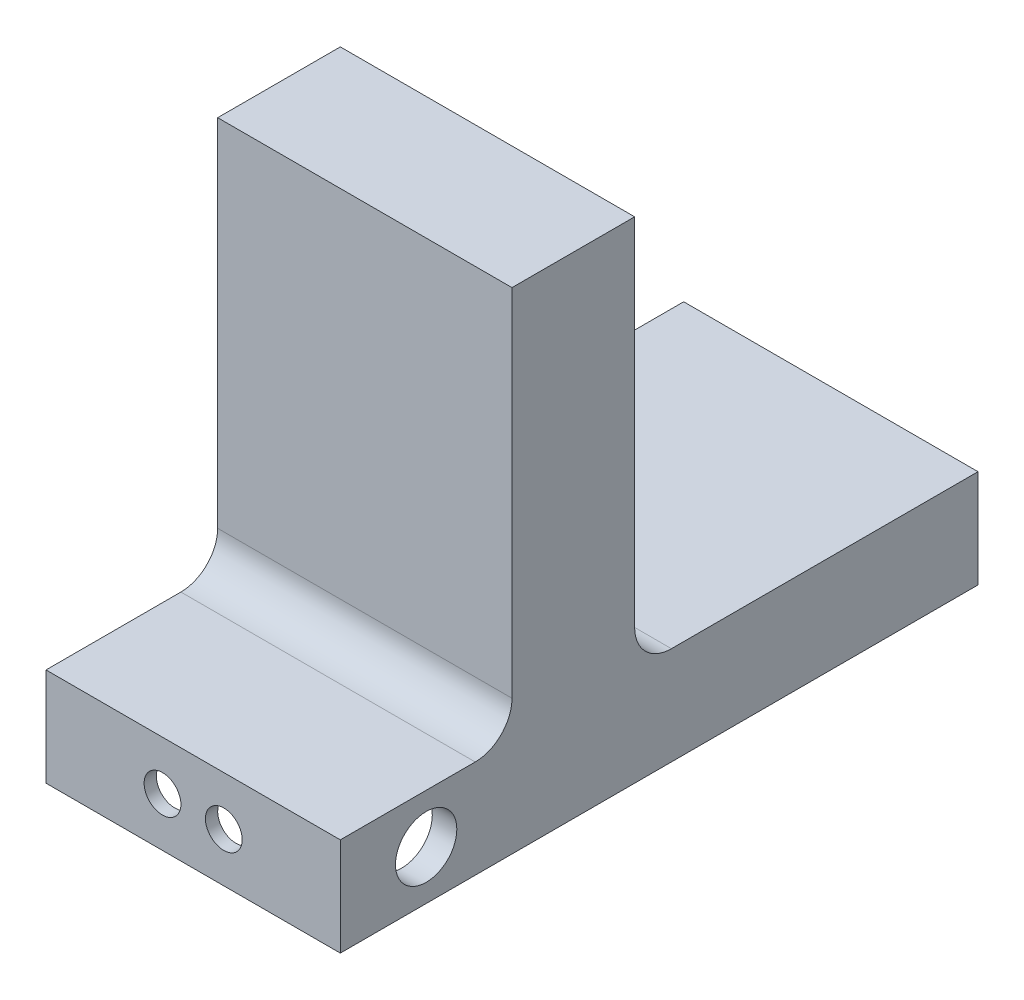
ISO-10303-21;
HEADER;
FILE_DESCRIPTION(('STEP AP214'),'2;1');
FILE_NAME('part.step','',(''),(''),'','','');
FILE_SCHEMA(('AUTOMOTIVE_DESIGN { 1 0 10303 214 1 1 1 1 }'));
ENDSEC;
DATA;
#1=APPLICATION_CONTEXT('core data for automotive mechanical design processes');
#2=APPLICATION_PROTOCOL_DEFINITION('international standard','automotive_design',2000,#1);
#3=PRODUCT_CONTEXT('',#1,'mechanical');
#4=PRODUCT('Part','Part','',(#3));
#5=PRODUCT_RELATED_PRODUCT_CATEGORY('part','',(#4));
#6=PRODUCT_DEFINITION_FORMATION('','',#4);
#7=PRODUCT_DEFINITION_CONTEXT('part definition',#1,'design');
#8=PRODUCT_DEFINITION('design','',#6,#7);
#9=PRODUCT_DEFINITION_SHAPE('','',#8);
#10=(LENGTH_UNIT() NAMED_UNIT(*) SI_UNIT(.MILLI.,.METRE.));
#11=(NAMED_UNIT(*) PLANE_ANGLE_UNIT() SI_UNIT($,.RADIAN.));
#12=(NAMED_UNIT(*) SI_UNIT($,.STERADIAN.) SOLID_ANGLE_UNIT());
#13=UNCERTAINTY_MEASURE_WITH_UNIT(LENGTH_MEASURE(1.E-05),#10,'distance_accuracy_value','');
#14=(GEOMETRIC_REPRESENTATION_CONTEXT(3) GLOBAL_UNCERTAINTY_ASSIGNED_CONTEXT((#13)) GLOBAL_UNIT_ASSIGNED_CONTEXT((#10,
#11,#12)) REPRESENTATION_CONTEXT('',''));
#15=CARTESIAN_POINT('',(0.,0.,0.));
#16=DIRECTION('',(0.,0.,1.));
#17=DIRECTION('',(1.,0.,0.));
#18=AXIS2_PLACEMENT_3D('',#15,#16,#17);
#19=CARTESIAN_POINT('',(9.99999999999999,35.,85.));
#20=DIRECTION('',(0.,0.,1.));
#21=DIRECTION('',(1.,0.,0.));
#22=AXIS2_PLACEMENT_3D('',#19,#20,#21);
#23=PLANE('',#22);
#24=DIRECTION('',(-1.,0.,0.));
#25=VECTOR('',#24,1.);
#26=CARTESIAN_POINT('',(9.99999999999999,0.,85.));
#27=LINE('',#26,#25);
#28=CARTESIAN_POINT('',(110.,0.,85.));
#29=VERTEX_POINT('',#28);
#30=CARTESIAN_POINT('',(67.5,0.,85.));
#31=VERTEX_POINT('',#30);
#32=EDGE_CURVE('E275',#29,#31,#27,.T.);
#33=ORIENTED_EDGE('',*,*,#32,.T.);
#34=DIRECTION('',(0.,-1.,0.));
#35=VECTOR('',#34,1.);
#36=CARTESIAN_POINT('',(67.5,0.,85.));
#37=LINE('',#36,#35);
#38=CARTESIAN_POINT('',(67.5,5.,85.));
#39=VERTEX_POINT('',#38);
#40=EDGE_CURVE('E193',#39,#31,#37,.T.);
#41=ORIENTED_EDGE('',*,*,#40,.F.);
#42=DIRECTION('',(-1.,0.,0.));
#43=VECTOR('',#42,1.);
#44=CARTESIAN_POINT('',(85.,5.,85.));
#45=LINE('',#44,#43);
#46=CARTESIAN_POINT('',(85.,5.,85.));
#47=VERTEX_POINT('',#46);
#48=EDGE_CURVE('E249',#47,#39,#45,.T.);
#49=ORIENTED_EDGE('',*,*,#48,.F.);
#50=DIRECTION('',(0.,-1.,0.));
#51=VECTOR('',#50,1.);
#52=CARTESIAN_POINT('',(85.,35.,85.));
#53=LINE('',#52,#51);
#54=CARTESIAN_POINT('',(85.,35.,85.));
#55=VERTEX_POINT('',#54);
#56=EDGE_CURVE('E232',#55,#47,#53,.T.);
#57=ORIENTED_EDGE('',*,*,#56,.F.);
#58=DIRECTION('',(-1.,0.,0.));
#59=VECTOR('',#58,1.);
#60=CARTESIAN_POINT('',(9.99999999999999,35.,85.));
#61=LINE('',#60,#59);
#62=CARTESIAN_POINT('',(110.,35.,85.));
#63=VERTEX_POINT('',#62);
#64=EDGE_CURVE('E282',#63,#55,#61,.T.);
#65=ORIENTED_EDGE('',*,*,#64,.F.);
#66=DIRECTION('',(0.,-1.,0.));
#67=VECTOR('',#66,1.);
#68=CARTESIAN_POINT('',(110.,35.,85.));
#69=LINE('',#68,#67);
#70=EDGE_CURVE('E299',#63,#29,#69,.T.);
#71=ORIENTED_EDGE('',*,*,#70,.T.);
#72=EDGE_LOOP('',(#33,#41,#49,#57,#65,#71));
#73=FACE_BOUND('',#72,.T.);
#74=ADVANCED_FACE('F37',(#73),#23,.F.);
#75=CARTESIAN_POINT('',(72.5,20.,-165.001));
#76=DIRECTION('',(0.,0.,1.));
#77=DIRECTION('',(1.,0.,0.));
#78=AXIS2_PLACEMENT_3D('',#75,#76,#77);
#79=CYLINDRICAL_SURFACE('',#78,7.50000000000001);
#80=CARTESIAN_POINT('',(72.5,20.,95.));
#81=DIRECTION('',(0.,0.,1.));
#82=DIRECTION('',(1.,0.,0.));
#83=AXIS2_PLACEMENT_3D('',#80,#81,#82);
#84=CIRCLE('',#83,7.50000000000001);
#85=CARTESIAN_POINT('',(80.,20.,95.));
#86=VERTEX_POINT('',#85);
#87=EDGE_CURVE('E264',#86,#86,#84,.T.);
#88=ORIENTED_EDGE('',*,*,#87,.T.);
#89=EDGE_LOOP('',(#88));
#90=FACE_BOUND('',#89,.T.);
#91=CARTESIAN_POINT('',(72.5,20.,90.));
#92=DIRECTION('',(0.,0.,-1.));
#93=DIRECTION('',(-1.,0.,0.));
#94=AXIS2_PLACEMENT_3D('',#91,#92,#93);
#95=CIRCLE('',#94,7.50000000000001);
#96=CARTESIAN_POINT('',(65.,20.,90.));
#97=VERTEX_POINT('',#96);
#98=EDGE_CURVE('E261',#97,#97,#95,.F.);
#99=ORIENTED_EDGE('',*,*,#98,.F.);
#100=EDGE_LOOP('',(#99));
#101=FACE_BOUND('',#100,.T.);
#102=ADVANCED_FACE('F384',(#90,#101),#79,.F.);
#103=CARTESIAN_POINT('',(47.5,20.,-165.001));
#104=DIRECTION('',(0.,0.,1.));
#105=DIRECTION('',(1.,0.,0.));
#106=AXIS2_PLACEMENT_3D('',#103,#104,#105);
#107=CYLINDRICAL_SURFACE('',#106,7.5);
#108=CARTESIAN_POINT('',(47.5,20.,95.));
#109=DIRECTION('',(0.,0.,1.));
#110=DIRECTION('',(1.,0.,0.));
#111=AXIS2_PLACEMENT_3D('',#108,#109,#110);
#112=CIRCLE('',#111,7.5);
#113=CARTESIAN_POINT('',(55.,20.,95.));
#114=VERTEX_POINT('',#113);
#115=EDGE_CURVE('E265',#114,#114,#112,.T.);
#116=ORIENTED_EDGE('',*,*,#115,.T.);
#117=EDGE_LOOP('',(#116));
#118=FACE_BOUND('',#117,.T.);
#119=CARTESIAN_POINT('',(47.5,20.,90.));
#120=DIRECTION('',(0.,0.,-1.));
#121=DIRECTION('',(-1.,0.,0.));
#122=AXIS2_PLACEMENT_3D('',#119,#120,#121);
#123=CIRCLE('',#122,7.5);
#124=CARTESIAN_POINT('',(40.,20.,90.));
#125=VERTEX_POINT('',#124);
#126=EDGE_CURVE('E255',#125,#125,#123,.F.);
#127=ORIENTED_EDGE('',*,*,#126,.F.);
#128=EDGE_LOOP('',(#127));
#129=FACE_BOUND('',#128,.T.);
#130=ADVANCED_FACE('F381',(#118,#129),#107,.F.);
#131=CARTESIAN_POINT('',(0.,0.,-25.));
#132=DIRECTION('',(0.,0.,1.));
#133=DIRECTION('',(1.,0.,0.));
#134=AXIS2_PLACEMENT_3D('',#131,#132,#133);
#135=PLANE('',#134);
#136=DIRECTION('',(0.,1.,0.));
#137=VECTOR('',#136,1.);
#138=CARTESIAN_POINT('',(120.,0.,-25.));
#139=LINE('',#138,#137);
#140=CARTESIAN_POINT('',(120.,55.,-25.));
#141=VERTEX_POINT('',#140);
#142=CARTESIAN_POINT('',(120.,200.,-25.));
#143=VERTEX_POINT('',#142);
#144=EDGE_CURVE('E349',#141,#143,#139,.T.);
#145=ORIENTED_EDGE('',*,*,#144,.F.);
#146=DIRECTION('',(1.,0.,0.));
#147=VECTOR('',#146,1.);
#148=CARTESIAN_POINT('',(0.,55.,-25.));
#149=LINE('',#148,#147);
#150=CARTESIAN_POINT('',(0.,55.,-25.));
#151=VERTEX_POINT('',#150);
#152=EDGE_CURVE('E373',#141,#151,#149,.F.);
#153=ORIENTED_EDGE('',*,*,#152,.T.);
#154=DIRECTION('',(0.,1.,0.));
#155=VECTOR('',#154,1.);
#156=CARTESIAN_POINT('',(0.,0.,-25.));
#157=LINE('',#156,#155);
#158=CARTESIAN_POINT('',(0.,200.,-25.));
#159=VERTEX_POINT('',#158);
#160=EDGE_CURVE('E342',#151,#159,#157,.T.);
#161=ORIENTED_EDGE('',*,*,#160,.T.);
#162=DIRECTION('',(1.,0.,0.));
#163=VECTOR('',#162,1.);
#164=CARTESIAN_POINT('',(0.,200.,-25.));
#165=LINE('',#164,#163);
#166=EDGE_CURVE('E337',#159,#143,#165,.T.);
#167=ORIENTED_EDGE('',*,*,#166,.T.);
#168=EDGE_LOOP('',(#145,#153,#161,#167));
#169=FACE_BOUND('',#168,.T.);
#170=ADVANCED_FACE('F383',(#169),#135,.F.);
#171=CARTESIAN_POINT('',(0.,200.,25.));
#172=DIRECTION('',(0.,1.,0.));
#173=DIRECTION('',(0.,0.,1.));
#174=AXIS2_PLACEMENT_3D('',#171,#172,#173);
#175=PLANE('',#174);
#176=ORIENTED_EDGE('',*,*,#166,.F.);
#177=DIRECTION('',(0.,0.,-1.));
#178=VECTOR('',#177,1.);
#179=CARTESIAN_POINT('',(0.,200.,25.));
#180=LINE('',#179,#178);
#181=CARTESIAN_POINT('',(0.,200.,25.));
#182=VERTEX_POINT('',#181);
#183=EDGE_CURVE('E352',#182,#159,#180,.T.);
#184=ORIENTED_EDGE('',*,*,#183,.F.);
#185=DIRECTION('',(1.,0.,0.));
#186=VECTOR('',#185,1.);
#187=CARTESIAN_POINT('',(0.,200.,25.));
#188=LINE('',#187,#186);
#189=CARTESIAN_POINT('',(120.,200.,25.));
#190=VERTEX_POINT('',#189);
#191=EDGE_CURVE('E338',#182,#190,#188,.T.);
#192=ORIENTED_EDGE('',*,*,#191,.T.);
#193=DIRECTION('',(0.,0.,-1.));
#194=VECTOR('',#193,1.);
#195=CARTESIAN_POINT('',(120.,200.,25.));
#196=LINE('',#195,#194);
#197=EDGE_CURVE('E346',#190,#143,#196,.T.);
#198=ORIENTED_EDGE('',*,*,#197,.T.);
#199=EDGE_LOOP('',(#176,#184,#192,#198));
#200=FACE_BOUND('',#199,.T.);
#201=ADVANCED_FACE('F391',(#200),#175,.T.);
#202=CARTESIAN_POINT('',(0.,0.,25.));
#203=DIRECTION('',(-1.,0.,0.));
#204=DIRECTION('',(0.,0.,1.));
#205=AXIS2_PLACEMENT_3D('',#202,#203,#204);
#206=PLANE('',#205);
#207=CARTESIAN_POINT('',(0.,20.,60.));
#208=DIRECTION('',(1.,0.,0.));
#209=DIRECTION('',(0.,0.,-1.));
#210=AXIS2_PLACEMENT_3D('',#207,#208,#209);
#211=CIRCLE('',#210,12.5);
#212=CARTESIAN_POINT('',(0.,20.,47.5));
#213=VERTEX_POINT('',#212);
#214=EDGE_CURVE('E219',#213,#213,#211,.T.);
#215=ORIENTED_EDGE('',*,*,#214,.T.);
#216=EDGE_LOOP('',(#215));
#217=FACE_BOUND('',#216,.T.);
#218=ORIENTED_EDGE('',*,*,#160,.F.);
#219=CARTESIAN_POINT('',(0.,55.,-40.));
#220=DIRECTION('',(-1.,0.,0.));
#221=DIRECTION('',(0.,0.,1.));
#222=AXIS2_PLACEMENT_3D('',#219,#220,#221);
#223=CIRCLE('',#222,15.);
#224=CARTESIAN_POINT('',(0.,40.,-40.));
#225=VERTEX_POINT('',#224);
#226=EDGE_CURVE('E11',#151,#225,#223,.F.);
#227=ORIENTED_EDGE('',*,*,#226,.T.);
#228=DIRECTION('',(0.,0.,1.));
#229=VECTOR('',#228,1.);
#230=CARTESIAN_POINT('',(0.,40.,-165.));
#231=LINE('',#230,#229);
#232=CARTESIAN_POINT('',(0.,40.,-165.));
#233=VERTEX_POINT('',#232);
#234=EDGE_CURVE('E318',#233,#225,#231,.T.);
#235=ORIENTED_EDGE('',*,*,#234,.F.);
#236=DIRECTION('',(0.,1.,0.));
#237=VECTOR('',#236,1.);
#238=CARTESIAN_POINT('',(0.,0.,-165.));
#239=LINE('',#238,#237);
#240=CARTESIAN_POINT('',(0.,0.,-165.));
#241=VERTEX_POINT('',#240);
#242=EDGE_CURVE('E298',#241,#233,#239,.T.);
#243=ORIENTED_EDGE('',*,*,#242,.F.);
#244=DIRECTION('',(0.,0.,-1.));
#245=VECTOR('',#244,1.);
#246=CARTESIAN_POINT('',(0.,0.,25.));
#247=LINE('',#246,#245);
#248=CARTESIAN_POINT('',(0.,0.,95.));
#249=VERTEX_POINT('',#248);
#250=EDGE_CURVE('E356',#249,#241,#247,.T.);
#251=ORIENTED_EDGE('',*,*,#250,.F.);
#252=DIRECTION('',(0.,-1.,0.));
#253=VECTOR('',#252,1.);
#254=CARTESIAN_POINT('',(0.,0.,95.));
#255=LINE('',#254,#253);
#256=CARTESIAN_POINT('',(0.,40.,95.));
#257=VERTEX_POINT('',#256);
#258=EDGE_CURVE('E321',#257,#249,#255,.T.);
#259=ORIENTED_EDGE('',*,*,#258,.F.);
#260=DIRECTION('',(0.,0.,-1.));
#261=VECTOR('',#260,1.);
#262=CARTESIAN_POINT('',(0.,40.,95.));
#263=LINE('',#262,#261);
#264=CARTESIAN_POINT('',(0.,40.,40.));
#265=VERTEX_POINT('',#264);
#266=EDGE_CURVE('E331',#257,#265,#263,.T.);
#267=ORIENTED_EDGE('',*,*,#266,.T.);
#268=CARTESIAN_POINT('',(0.,55.,40.));
#269=DIRECTION('',(-1.,0.,0.));
#270=DIRECTION('',(0.,0.,1.));
#271=AXIS2_PLACEMENT_3D('',#268,#269,#270);
#272=CIRCLE('',#271,15.);
#273=CARTESIAN_POINT('',(0.,55.,25.));
#274=VERTEX_POINT('',#273);
#275=EDGE_CURVE('E366',#265,#274,#272,.F.);
#276=ORIENTED_EDGE('',*,*,#275,.T.);
#277=DIRECTION('',(0.,1.,0.));
#278=VECTOR('',#277,1.);
#279=CARTESIAN_POINT('',(0.,0.,25.));
#280=LINE('',#279,#278);
#281=EDGE_CURVE('E344',#274,#182,#280,.T.);
#282=ORIENTED_EDGE('',*,*,#281,.T.);
#283=ORIENTED_EDGE('',*,*,#183,.T.);
#284=EDGE_LOOP('',(#218,#227,#235,#243,#251,#259,#267,#276,#282,#283));
#285=FACE_BOUND('',#284,.T.);
#286=ADVANCED_FACE('F477',(#217,#285),#206,.T.);
#287=CARTESIAN_POINT('',(0.,0.,25.));
#288=DIRECTION('',(0.,1.,0.));
#289=DIRECTION('',(0.,0.,1.));
#290=AXIS2_PLACEMENT_3D('',#287,#288,#289);
#291=PLANE('',#290);
#292=DIRECTION('',(-1.,0.,0.));
#293=VECTOR('',#292,1.);
#294=CARTESIAN_POINT('',(67.5,0.,88.));
#295=LINE('',#294,#293);
#296=CARTESIAN_POINT('',(67.5,0.,88.));
#297=VERTEX_POINT('',#296);
#298=CARTESIAN_POINT('',(52.5,0.,88.));
#299=VERTEX_POINT('',#298);
#300=EDGE_CURVE('E202',#297,#299,#295,.T.);
#301=ORIENTED_EDGE('',*,*,#300,.F.);
#302=DIRECTION('',(0.,0.,-1.));
#303=VECTOR('',#302,1.);
#304=CARTESIAN_POINT('',(67.5,0.,88.));
#305=LINE('',#304,#303);
#306=EDGE_CURVE('E188',#297,#31,#305,.T.);
#307=ORIENTED_EDGE('',*,*,#306,.T.);
#308=ORIENTED_EDGE('',*,*,#32,.F.);
#309=DIRECTION('',(0.,0.,1.));
#310=VECTOR('',#309,1.);
#311=CARTESIAN_POINT('',(110.,0.,85.));
#312=LINE('',#311,#310);
#313=CARTESIAN_POINT('',(110.,0.,4.99999999999999));
#314=VERTEX_POINT('',#313);
#315=EDGE_CURVE('E290',#314,#29,#312,.T.);
#316=ORIENTED_EDGE('',*,*,#315,.F.);
#317=DIRECTION('',(1.,0.,0.));
#318=VECTOR('',#317,1.);
#319=CARTESIAN_POINT('',(10.,0.,4.99999999999999));
#320=LINE('',#319,#318);
#321=CARTESIAN_POINT('',(10.,0.,4.99999999999999));
#322=VERTEX_POINT('',#321);
#323=EDGE_CURVE('E287',#322,#314,#320,.T.);
#324=ORIENTED_EDGE('',*,*,#323,.F.);
#325=DIRECTION('',(0.,0.,-1.));
#326=VECTOR('',#325,1.);
#327=CARTESIAN_POINT('',(9.99999999999999,0.,85.));
#328=LINE('',#327,#326);
#329=CARTESIAN_POINT('',(9.99999999999999,0.,85.));
#330=VERTEX_POINT('',#329);
#331=EDGE_CURVE('E268',#330,#322,#328,.T.);
#332=ORIENTED_EDGE('',*,*,#331,.F.);
#333=CARTESIAN_POINT('',(52.5,0.,85.));
#334=VERTEX_POINT('',#333);
#335=EDGE_CURVE('E293',#334,#330,#27,.T.);
#336=ORIENTED_EDGE('',*,*,#335,.F.);
#337=DIRECTION('',(0.,0.,-1.));
#338=VECTOR('',#337,1.);
#339=CARTESIAN_POINT('',(52.5,0.,88.));
#340=LINE('',#339,#338);
#341=EDGE_CURVE('E198',#299,#334,#340,.T.);
#342=ORIENTED_EDGE('',*,*,#341,.F.);
#343=EDGE_LOOP('',(#301,#307,#308,#316,#324,#332,#336,#342));
#344=FACE_BOUND('',#343,.T.);
#345=ORIENTED_EDGE('',*,*,#250,.T.);
#346=DIRECTION('',(-1.,0.,0.));
#347=VECTOR('',#346,1.);
#348=CARTESIAN_POINT('',(0.,0.,-165.));
#349=LINE('',#348,#347);
#350=CARTESIAN_POINT('',(120.,0.,-165.));
#351=VERTEX_POINT('',#350);
#352=EDGE_CURVE('E312',#351,#241,#349,.T.);
#353=ORIENTED_EDGE('',*,*,#352,.F.);
#354=DIRECTION('',(0.,0.,-1.));
#355=VECTOR('',#354,1.);
#356=CARTESIAN_POINT('',(120.,0.,25.));
#357=LINE('',#356,#355);
#358=CARTESIAN_POINT('',(120.,0.,95.));
#359=VERTEX_POINT('',#358);
#360=EDGE_CURVE('E358',#359,#351,#357,.T.);
#361=ORIENTED_EDGE('',*,*,#360,.F.);
#362=DIRECTION('',(1.,0.,0.));
#363=VECTOR('',#362,1.);
#364=CARTESIAN_POINT('',(0.,0.,95.));
#365=LINE('',#364,#363);
#366=EDGE_CURVE('E324',#249,#359,#365,.T.);
#367=ORIENTED_EDGE('',*,*,#366,.F.);
#368=EDGE_LOOP('',(#345,#353,#361,#367));
#369=FACE_BOUND('',#368,.T.);
#370=ADVANCED_FACE('F208',(#344,#369),#291,.F.);
#371=CARTESIAN_POINT('',(120.,0.,25.));
#372=DIRECTION('',(-1.,0.,0.));
#373=DIRECTION('',(0.,0.,1.));
#374=AXIS2_PLACEMENT_3D('',#371,#372,#373);
#375=PLANE('',#374);
#376=CARTESIAN_POINT('',(120.,20.,60.));
#377=DIRECTION('',(-1.,0.,0.));
#378=DIRECTION('',(0.,0.,1.));
#379=AXIS2_PLACEMENT_3D('',#376,#377,#378);
#380=CIRCLE('',#379,12.5);
#381=CARTESIAN_POINT('',(120.,20.,72.5));
#382=VERTEX_POINT('',#381);
#383=EDGE_CURVE('E229',#382,#382,#380,.T.);
#384=ORIENTED_EDGE('',*,*,#383,.T.);
#385=EDGE_LOOP('',(#384));
#386=FACE_BOUND('',#385,.T.);
#387=ORIENTED_EDGE('',*,*,#360,.T.);
#388=DIRECTION('',(0.,-1.,0.));
#389=VECTOR('',#388,1.);
#390=CARTESIAN_POINT('',(120.,0.,-165.));
#391=LINE('',#390,#389);
#392=CARTESIAN_POINT('',(120.,40.,-165.));
#393=VERTEX_POINT('',#392);
#394=EDGE_CURVE('E309',#393,#351,#391,.T.);
#395=ORIENTED_EDGE('',*,*,#394,.F.);
#396=DIRECTION('',(0.,0.,1.));
#397=VECTOR('',#396,1.);
#398=CARTESIAN_POINT('',(120.,40.,-165.));
#399=LINE('',#398,#397);
#400=CARTESIAN_POINT('',(120.,40.,-40.));
#401=VERTEX_POINT('',#400);
#402=EDGE_CURVE('E315',#393,#401,#399,.T.);
#403=ORIENTED_EDGE('',*,*,#402,.T.);
#404=CARTESIAN_POINT('',(120.,55.,-40.));
#405=DIRECTION('',(-1.,0.,0.));
#406=DIRECTION('',(0.,0.,1.));
#407=AXIS2_PLACEMENT_3D('',#404,#405,#406);
#408=CIRCLE('',#407,15.);
#409=EDGE_CURVE('E46',#401,#141,#408,.T.);
#410=ORIENTED_EDGE('',*,*,#409,.T.);
#411=ORIENTED_EDGE('',*,*,#144,.T.);
#412=ORIENTED_EDGE('',*,*,#197,.F.);
#413=DIRECTION('',(0.,1.,0.));
#414=VECTOR('',#413,1.);
#415=CARTESIAN_POINT('',(120.,0.,25.));
#416=LINE('',#415,#414);
#417=CARTESIAN_POINT('',(120.,55.,25.));
#418=VERTEX_POINT('',#417);
#419=EDGE_CURVE('E341',#418,#190,#416,.T.);
#420=ORIENTED_EDGE('',*,*,#419,.F.);
#421=CARTESIAN_POINT('',(120.,55.,40.));
#422=DIRECTION('',(-1.,0.,0.));
#423=DIRECTION('',(0.,0.,1.));
#424=AXIS2_PLACEMENT_3D('',#421,#422,#423);
#425=CIRCLE('',#424,15.);
#426=CARTESIAN_POINT('',(120.,40.,40.));
#427=VERTEX_POINT('',#426);
#428=EDGE_CURVE('E368',#418,#427,#425,.T.);
#429=ORIENTED_EDGE('',*,*,#428,.T.);
#430=DIRECTION('',(0.,0.,-1.));
#431=VECTOR('',#430,1.);
#432=CARTESIAN_POINT('',(120.,40.,95.));
#433=LINE('',#432,#431);
#434=CARTESIAN_POINT('',(120.,40.,95.));
#435=VERTEX_POINT('',#434);
#436=EDGE_CURVE('E334',#435,#427,#433,.T.);
#437=ORIENTED_EDGE('',*,*,#436,.F.);
#438=DIRECTION('',(0.,1.,0.));
#439=VECTOR('',#438,1.);
#440=CARTESIAN_POINT('',(120.,0.,95.));
#441=LINE('',#440,#439);
#442=EDGE_CURVE('E327',#359,#435,#441,.T.);
#443=ORIENTED_EDGE('',*,*,#442,.F.);
#444=EDGE_LOOP('',(#387,#395,#403,#410,#411,#412,#420,#429,#437,#443));
#445=FACE_BOUND('',#444,.T.);
#446=ADVANCED_FACE('F474',(#386,#445),#375,.F.);
#447=CARTESIAN_POINT('',(0.,0.,25.));
#448=DIRECTION('',(0.,0.,1.));
#449=DIRECTION('',(1.,0.,0.));
#450=AXIS2_PLACEMENT_3D('',#447,#448,#449);
#451=PLANE('',#450);
#452=ORIENTED_EDGE('',*,*,#281,.F.);
#453=DIRECTION('',(-1.,0.,0.));
#454=VECTOR('',#453,1.);
#455=CARTESIAN_POINT('',(0.,55.,25.));
#456=LINE('',#455,#454);
#457=EDGE_CURVE('E364',#274,#418,#456,.F.);
#458=ORIENTED_EDGE('',*,*,#457,.T.);
#459=ORIENTED_EDGE('',*,*,#419,.T.);
#460=ORIENTED_EDGE('',*,*,#191,.F.);
#461=EDGE_LOOP('',(#452,#458,#459,#460));
#462=FACE_BOUND('',#461,.T.);
#463=ADVANCED_FACE('F471',(#462),#451,.T.);
#464=CARTESIAN_POINT('',(0.,40.,95.));
#465=DIRECTION('',(0.,-1.,0.));
#466=DIRECTION('',(0.,0.,-1.));
#467=AXIS2_PLACEMENT_3D('',#464,#465,#466);
#468=PLANE('',#467);
#469=ORIENTED_EDGE('',*,*,#436,.T.);
#470=DIRECTION('',(-1.,0.,0.));
#471=VECTOR('',#470,1.);
#472=CARTESIAN_POINT('',(0.,40.,40.));
#473=LINE('',#472,#471);
#474=EDGE_CURVE('E355',#427,#265,#473,.T.);
#475=ORIENTED_EDGE('',*,*,#474,.T.);
#476=ORIENTED_EDGE('',*,*,#266,.F.);
#477=DIRECTION('',(-1.,0.,0.));
#478=VECTOR('',#477,1.);
#479=CARTESIAN_POINT('',(0.,40.,95.));
#480=LINE('',#479,#478);
#481=EDGE_CURVE('E329',#435,#257,#480,.T.);
#482=ORIENTED_EDGE('',*,*,#481,.F.);
#483=EDGE_LOOP('',(#469,#475,#476,#482));
#484=FACE_BOUND('',#483,.T.);
#485=ADVANCED_FACE('F467',(#484),#468,.F.);
#486=CARTESIAN_POINT('',(0.,0.,95.));
#487=DIRECTION('',(0.,0.,-1.));
#488=DIRECTION('',(-1.,0.,0.));
#489=AXIS2_PLACEMENT_3D('',#486,#487,#488);
#490=PLANE('',#489);
#491=ORIENTED_EDGE('',*,*,#115,.F.);
#492=EDGE_LOOP('',(#491));
#493=FACE_BOUND('',#492,.T.);
#494=ORIENTED_EDGE('',*,*,#87,.F.);
#495=EDGE_LOOP('',(#494));
#496=FACE_BOUND('',#495,.T.);
#497=ORIENTED_EDGE('',*,*,#258,.T.);
#498=ORIENTED_EDGE('',*,*,#366,.T.);
#499=ORIENTED_EDGE('',*,*,#442,.T.);
#500=ORIENTED_EDGE('',*,*,#481,.T.);
#501=EDGE_LOOP('',(#497,#498,#499,#500));
#502=FACE_BOUND('',#501,.T.);
#503=ADVANCED_FACE('F464',(#493,#496,#502),#490,.F.);
#504=CARTESIAN_POINT('',(0.,55.,40.));
#505=DIRECTION('',(-1.,0.,0.));
#506=DIRECTION('',(0.,0.,1.));
#507=AXIS2_PLACEMENT_3D('',#504,#505,#506);
#508=CYLINDRICAL_SURFACE('',#507,15.);
#509=ORIENTED_EDGE('',*,*,#428,.F.);
#510=ORIENTED_EDGE('',*,*,#457,.F.);
#511=ORIENTED_EDGE('',*,*,#275,.F.);
#512=ORIENTED_EDGE('',*,*,#474,.F.);
#513=EDGE_LOOP('',(#509,#510,#511,#512));
#514=FACE_BOUND('',#513,.T.);
#515=ADVANCED_FACE('F462',(#514),#508,.F.);
#516=CARTESIAN_POINT('',(0.,40.,-165.));
#517=DIRECTION('',(0.,-1.,0.));
#518=DIRECTION('',(1.,0.,0.));
#519=AXIS2_PLACEMENT_3D('',#516,#517,#518);
#520=PLANE('',#519);
#521=ORIENTED_EDGE('',*,*,#234,.T.);
#522=DIRECTION('',(1.,0.,0.));
#523=VECTOR('',#522,1.);
#524=CARTESIAN_POINT('',(120.,40.,-40.));
#525=LINE('',#524,#523);
#526=EDGE_CURVE('E370',#225,#401,#525,.T.);
#527=ORIENTED_EDGE('',*,*,#526,.T.);
#528=ORIENTED_EDGE('',*,*,#402,.F.);
#529=DIRECTION('',(1.,0.,0.));
#530=VECTOR('',#529,1.);
#531=CARTESIAN_POINT('',(0.,40.,-165.));
#532=LINE('',#531,#530);
#533=EDGE_CURVE('E307',#233,#393,#532,.T.);
#534=ORIENTED_EDGE('',*,*,#533,.F.);
#535=EDGE_LOOP('',(#521,#527,#528,#534));
#536=FACE_BOUND('',#535,.T.);
#537=ADVANCED_FACE('F458',(#536),#520,.F.);
#538=CARTESIAN_POINT('',(0.,0.,-165.));
#539=DIRECTION('',(0.,0.,-1.));
#540=DIRECTION('',(-1.,0.,0.));
#541=AXIS2_PLACEMENT_3D('',#538,#539,#540);
#542=PLANE('',#541);
#543=ORIENTED_EDGE('',*,*,#242,.T.);
#544=ORIENTED_EDGE('',*,*,#533,.T.);
#545=ORIENTED_EDGE('',*,*,#394,.T.);
#546=ORIENTED_EDGE('',*,*,#352,.T.);
#547=EDGE_LOOP('',(#543,#544,#545,#546));
#548=FACE_BOUND('',#547,.T.);
#549=ADVANCED_FACE('F455',(#548),#542,.T.);
#550=CARTESIAN_POINT('',(0.,55.,-40.));
#551=DIRECTION('',(-1.,0.,0.));
#552=DIRECTION('',(0.,-1.,0.));
#553=AXIS2_PLACEMENT_3D('',#550,#551,#552);
#554=CYLINDRICAL_SURFACE('',#553,15.);
#555=ORIENTED_EDGE('',*,*,#226,.F.);
#556=ORIENTED_EDGE('',*,*,#152,.F.);
#557=ORIENTED_EDGE('',*,*,#409,.F.);
#558=ORIENTED_EDGE('',*,*,#526,.F.);
#559=EDGE_LOOP('',(#555,#556,#557,#558));
#560=FACE_BOUND('',#559,.T.);
#561=ADVANCED_FACE('F39',(#560),#554,.F.);
#562=CARTESIAN_POINT('',(9.99999999999999,35.,85.));
#563=DIRECTION('',(-1.,0.,0.));
#564=DIRECTION('',(0.,0.,1.));
#565=AXIS2_PLACEMENT_3D('',#562,#563,#564);
#566=PLANE('',#565);
#567=CARTESIAN_POINT('',(9.99999999999999,20.,60.));
#568=DIRECTION('',(-1.,0.,0.));
#569=DIRECTION('',(0.,0.,1.));
#570=AXIS2_PLACEMENT_3D('',#567,#568,#569);
#571=CIRCLE('',#570,12.5);
#572=CARTESIAN_POINT('',(9.99999999999999,20.,72.5));
#573=VERTEX_POINT('',#572);
#574=EDGE_CURVE('E226',#573,#573,#571,.T.);
#575=ORIENTED_EDGE('',*,*,#574,.T.);
#576=EDGE_LOOP('',(#575));
#577=FACE_BOUND('',#576,.T.);
#578=ORIENTED_EDGE('',*,*,#331,.T.);
#579=DIRECTION('',(0.,-1.,0.));
#580=VECTOR('',#579,1.);
#581=CARTESIAN_POINT('',(10.,35.,4.99999999999999));
#582=LINE('',#581,#580);
#583=CARTESIAN_POINT('',(10.,35.,4.99999999999999));
#584=VERTEX_POINT('',#583);
#585=EDGE_CURVE('E285',#584,#322,#582,.T.);
#586=ORIENTED_EDGE('',*,*,#585,.F.);
#587=DIRECTION('',(0.,0.,-1.));
#588=VECTOR('',#587,1.);
#589=CARTESIAN_POINT('',(9.99999999999999,35.,85.));
#590=LINE('',#589,#588);
#591=CARTESIAN_POINT('',(9.99999999999999,35.,85.));
#592=VERTEX_POINT('',#591);
#593=EDGE_CURVE('E271',#592,#584,#590,.T.);
#594=ORIENTED_EDGE('',*,*,#593,.F.);
#595=DIRECTION('',(0.,-1.,0.));
#596=VECTOR('',#595,1.);
#597=CARTESIAN_POINT('',(9.99999999999999,35.,85.));
#598=LINE('',#597,#596);
#599=EDGE_CURVE('E295',#592,#330,#598,.T.);
#600=ORIENTED_EDGE('',*,*,#599,.T.);
#601=EDGE_LOOP('',(#578,#586,#594,#600));
#602=FACE_BOUND('',#601,.T.);
#603=ADVANCED_FACE('F407',(#577,#602),#566,.F.);
#604=CARTESIAN_POINT('',(52.5,5.,85.));
#605=VERTEX_POINT('',#604);
#606=CARTESIAN_POINT('',(35.,5.,85.));
#607=VERTEX_POINT('',#606);
#608=EDGE_CURVE('E248',#605,#607,#45,.T.);
#609=ORIENTED_EDGE('',*,*,#608,.F.);
#610=DIRECTION('',(0.,1.,0.));
#611=VECTOR('',#610,1.);
#612=CARTESIAN_POINT('',(52.5,0.,85.));
#613=LINE('',#612,#611);
#614=EDGE_CURVE('E206',#334,#605,#613,.T.);
#615=ORIENTED_EDGE('',*,*,#614,.F.);
#616=ORIENTED_EDGE('',*,*,#335,.T.);
#617=ORIENTED_EDGE('',*,*,#599,.F.);
#618=CARTESIAN_POINT('',(35.,35.,85.));
#619=VERTEX_POINT('',#618);
#620=EDGE_CURVE('E281',#619,#592,#61,.T.);
#621=ORIENTED_EDGE('',*,*,#620,.F.);
#622=DIRECTION('',(0.,1.,0.));
#623=VECTOR('',#622,1.);
#624=CARTESIAN_POINT('',(35.,35.,85.));
#625=LINE('',#624,#623);
#626=EDGE_CURVE('E62',#607,#619,#625,.T.);
#627=ORIENTED_EDGE('',*,*,#626,.F.);
#628=EDGE_LOOP('',(#609,#615,#616,#617,#621,#627));
#629=FACE_BOUND('',#628,.T.);
#630=ADVANCED_FACE('F400',(#629),#23,.F.);
#631=CARTESIAN_POINT('',(110.,35.,85.));
#632=DIRECTION('',(1.,0.,0.));
#633=DIRECTION('',(0.,0.,-1.));
#634=AXIS2_PLACEMENT_3D('',#631,#632,#633);
#635=PLANE('',#634);
#636=CARTESIAN_POINT('',(110.,20.,60.));
#637=DIRECTION('',(1.,0.,0.));
#638=DIRECTION('',(0.,0.,-1.));
#639=AXIS2_PLACEMENT_3D('',#636,#637,#638);
#640=CIRCLE('',#639,12.5);
#641=CARTESIAN_POINT('',(110.,20.,47.5));
#642=VERTEX_POINT('',#641);
#643=EDGE_CURVE('E41',#642,#642,#640,.T.);
#644=ORIENTED_EDGE('',*,*,#643,.T.);
#645=EDGE_LOOP('',(#644));
#646=FACE_BOUND('',#645,.T.);
#647=ORIENTED_EDGE('',*,*,#315,.T.);
#648=ORIENTED_EDGE('',*,*,#70,.F.);
#649=DIRECTION('',(0.,0.,1.));
#650=VECTOR('',#649,1.);
#651=CARTESIAN_POINT('',(110.,35.,85.));
#652=LINE('',#651,#650);
#653=CARTESIAN_POINT('',(110.,35.,4.99999999999999));
#654=VERTEX_POINT('',#653);
#655=EDGE_CURVE('E278',#654,#63,#652,.T.);
#656=ORIENTED_EDGE('',*,*,#655,.F.);
#657=DIRECTION('',(0.,-1.,0.));
#658=VECTOR('',#657,1.);
#659=CARTESIAN_POINT('',(110.,35.,4.99999999999999));
#660=LINE('',#659,#658);
#661=EDGE_CURVE('E301',#654,#314,#660,.T.);
#662=ORIENTED_EDGE('',*,*,#661,.T.);
#663=EDGE_LOOP('',(#647,#648,#656,#662));
#664=FACE_BOUND('',#663,.T.);
#665=ADVANCED_FACE('F406',(#646,#664),#635,.F.);
#666=CARTESIAN_POINT('',(10.,35.,4.99999999999999));
#667=DIRECTION('',(0.,0.,-1.));
#668=DIRECTION('',(-1.,0.,0.));
#669=AXIS2_PLACEMENT_3D('',#666,#667,#668);
#670=PLANE('',#669);
#671=ORIENTED_EDGE('',*,*,#323,.T.);
#672=ORIENTED_EDGE('',*,*,#661,.F.);
#673=DIRECTION('',(1.,0.,0.));
#674=VECTOR('',#673,1.);
#675=CARTESIAN_POINT('',(10.,35.,4.99999999999999));
#676=LINE('',#675,#674);
#677=EDGE_CURVE('E274',#584,#654,#676,.T.);
#678=ORIENTED_EDGE('',*,*,#677,.F.);
#679=ORIENTED_EDGE('',*,*,#585,.T.);
#680=EDGE_LOOP('',(#671,#672,#678,#679));
#681=FACE_BOUND('',#680,.T.);
#682=ADVANCED_FACE('F413',(#681),#670,.F.);
#683=CARTESIAN_POINT('',(0.,35.,0.));
#684=DIRECTION('',(0.,-1.,0.));
#685=DIRECTION('',(0.,0.,-1.));
#686=AXIS2_PLACEMENT_3D('',#683,#684,#685);
#687=PLANE('',#686);
#688=ORIENTED_EDGE('',*,*,#593,.T.);
#689=ORIENTED_EDGE('',*,*,#677,.T.);
#690=ORIENTED_EDGE('',*,*,#655,.T.);
#691=ORIENTED_EDGE('',*,*,#64,.T.);
#692=DIRECTION('',(0.,0.,-1.));
#693=VECTOR('',#692,1.);
#694=CARTESIAN_POINT('',(85.,35.,90.));
#695=LINE('',#694,#693);
#696=CARTESIAN_POINT('',(85.,35.,90.));
#697=VERTEX_POINT('',#696);
#698=EDGE_CURVE('E253',#697,#55,#695,.T.);
#699=ORIENTED_EDGE('',*,*,#698,.F.);
#700=DIRECTION('',(1.,0.,0.));
#701=VECTOR('',#700,1.);
#702=CARTESIAN_POINT('',(85.,35.,90.));
#703=LINE('',#702,#701);
#704=CARTESIAN_POINT('',(35.,35.,90.));
#705=VERTEX_POINT('',#704);
#706=EDGE_CURVE('E242',#705,#697,#703,.T.);
#707=ORIENTED_EDGE('',*,*,#706,.F.);
#708=DIRECTION('',(0.,0.,-1.));
#709=VECTOR('',#708,1.);
#710=CARTESIAN_POINT('',(35.,35.,90.));
#711=LINE('',#710,#709);
#712=EDGE_CURVE('E256',#705,#619,#711,.T.);
#713=ORIENTED_EDGE('',*,*,#712,.T.);
#714=ORIENTED_EDGE('',*,*,#620,.T.);
#715=EDGE_LOOP('',(#688,#689,#690,#691,#699,#707,#713,#714));
#716=FACE_BOUND('',#715,.T.);
#717=ADVANCED_FACE('F444',(#716),#687,.T.);
#718=CARTESIAN_POINT('',(0.,0.,90.));
#719=DIRECTION('',(0.,0.,-1.));
#720=DIRECTION('',(-1.,0.,0.));
#721=AXIS2_PLACEMENT_3D('',#718,#719,#720);
#722=PLANE('',#721);
#723=DIRECTION('',(0.,-1.,0.));
#724=VECTOR('',#723,1.);
#725=CARTESIAN_POINT('',(85.,35.,90.));
#726=LINE('',#725,#724);
#727=CARTESIAN_POINT('',(85.,5.,90.));
#728=VERTEX_POINT('',#727);
#729=EDGE_CURVE('E233',#697,#728,#726,.T.);
#730=ORIENTED_EDGE('',*,*,#729,.T.);
#731=DIRECTION('',(-1.,0.,0.));
#732=VECTOR('',#731,1.);
#733=CARTESIAN_POINT('',(85.,5.,90.));
#734=LINE('',#733,#732);
#735=CARTESIAN_POINT('',(35.,5.,90.));
#736=VERTEX_POINT('',#735);
#737=EDGE_CURVE('E236',#728,#736,#734,.T.);
#738=ORIENTED_EDGE('',*,*,#737,.T.);
#739=DIRECTION('',(0.,1.,0.));
#740=VECTOR('',#739,1.);
#741=CARTESIAN_POINT('',(35.,35.,90.));
#742=LINE('',#741,#740);
#743=EDGE_CURVE('E239',#736,#705,#742,.T.);
#744=ORIENTED_EDGE('',*,*,#743,.T.);
#745=ORIENTED_EDGE('',*,*,#706,.T.);
#746=EDGE_LOOP('',(#730,#738,#744,#745));
#747=FACE_BOUND('',#746,.T.);
#748=ORIENTED_EDGE('',*,*,#126,.T.);
#749=EDGE_LOOP('',(#748));
#750=FACE_BOUND('',#749,.T.);
#751=ORIENTED_EDGE('',*,*,#98,.T.);
#752=EDGE_LOOP('',(#751));
#753=FACE_BOUND('',#752,.T.);
#754=ADVANCED_FACE('F378',(#747,#750,#753),#722,.T.);
#755=CARTESIAN_POINT('',(85.,35.,90.));
#756=DIRECTION('',(1.,0.,0.));
#757=DIRECTION('',(0.,0.,-1.));
#758=AXIS2_PLACEMENT_3D('',#755,#756,#757);
#759=PLANE('',#758);
#760=ORIENTED_EDGE('',*,*,#56,.T.);
#761=DIRECTION('',(0.,0.,-1.));
#762=VECTOR('',#761,1.);
#763=CARTESIAN_POINT('',(85.,5.,90.));
#764=LINE('',#763,#762);
#765=EDGE_CURVE('E245',#728,#47,#764,.T.);
#766=ORIENTED_EDGE('',*,*,#765,.F.);
#767=ORIENTED_EDGE('',*,*,#729,.F.);
#768=ORIENTED_EDGE('',*,*,#698,.T.);
#769=EDGE_LOOP('',(#760,#766,#767,#768));
#770=FACE_BOUND('',#769,.T.);
#771=ADVANCED_FACE('F431',(#770),#759,.F.);
#772=CARTESIAN_POINT('',(35.,35.,90.));
#773=DIRECTION('',(-1.,0.,0.));
#774=DIRECTION('',(0.,-1.,0.));
#775=AXIS2_PLACEMENT_3D('',#772,#773,#774);
#776=PLANE('',#775);
#777=ORIENTED_EDGE('',*,*,#626,.T.);
#778=ORIENTED_EDGE('',*,*,#712,.F.);
#779=ORIENTED_EDGE('',*,*,#743,.F.);
#780=DIRECTION('',(0.,0.,-1.));
#781=VECTOR('',#780,1.);
#782=CARTESIAN_POINT('',(35.,5.,90.));
#783=LINE('',#782,#781);
#784=EDGE_CURVE('E258',#736,#607,#783,.T.);
#785=ORIENTED_EDGE('',*,*,#784,.T.);
#786=EDGE_LOOP('',(#777,#778,#779,#785));
#787=FACE_BOUND('',#786,.T.);
#788=ADVANCED_FACE('F424',(#787),#776,.F.);
#789=CARTESIAN_POINT('',(85.,5.,90.));
#790=DIRECTION('',(0.,-1.,0.));
#791=DIRECTION('',(0.,0.,-1.));
#792=AXIS2_PLACEMENT_3D('',#789,#790,#791);
#793=PLANE('',#792);
#794=ORIENTED_EDGE('',*,*,#48,.T.);
#795=DIRECTION('',(0.,0.,-1.));
#796=VECTOR('',#795,1.);
#797=CARTESIAN_POINT('',(67.5,5.,88.));
#798=LINE('',#797,#796);
#799=CARTESIAN_POINT('',(67.5,5.,88.));
#800=VERTEX_POINT('',#799);
#801=EDGE_CURVE('E217',#800,#39,#798,.T.);
#802=ORIENTED_EDGE('',*,*,#801,.F.);
#803=DIRECTION('',(1.,0.,0.));
#804=VECTOR('',#803,1.);
#805=CARTESIAN_POINT('',(67.5,5.,88.));
#806=LINE('',#805,#804);
#807=CARTESIAN_POINT('',(52.5,5.,88.));
#808=VERTEX_POINT('',#807);
#809=EDGE_CURVE('E199',#808,#800,#806,.T.);
#810=ORIENTED_EDGE('',*,*,#809,.F.);
#811=DIRECTION('',(0.,0.,-1.));
#812=VECTOR('',#811,1.);
#813=CARTESIAN_POINT('',(52.5,5.,88.));
#814=LINE('',#813,#812);
#815=EDGE_CURVE('E220',#808,#605,#814,.T.);
#816=ORIENTED_EDGE('',*,*,#815,.T.);
#817=ORIENTED_EDGE('',*,*,#608,.T.);
#818=ORIENTED_EDGE('',*,*,#784,.F.);
#819=ORIENTED_EDGE('',*,*,#737,.F.);
#820=ORIENTED_EDGE('',*,*,#765,.T.);
#821=EDGE_LOOP('',(#794,#802,#810,#816,#817,#818,#819,#820));
#822=FACE_BOUND('',#821,.T.);
#823=ADVANCED_FACE('F421',(#822),#793,.F.);
#824=CARTESIAN_POINT('',(0.,20.,60.));
#825=DIRECTION('',(1.,0.,0.));
#826=DIRECTION('',(0.,0.,-1.));
#827=AXIS2_PLACEMENT_3D('',#824,#825,#826);
#828=CYLINDRICAL_SURFACE('',#827,12.5);
#829=ORIENTED_EDGE('',*,*,#643,.F.);
#830=EDGE_LOOP('',(#829));
#831=FACE_BOUND('',#830,.T.);
#832=ORIENTED_EDGE('',*,*,#383,.F.);
#833=EDGE_LOOP('',(#832));
#834=FACE_BOUND('',#833,.T.);
#835=ADVANCED_FACE('F550',(#831,#834),#828,.F.);
#836=ORIENTED_EDGE('',*,*,#214,.F.);
#837=EDGE_LOOP('',(#836));
#838=FACE_BOUND('',#837,.T.);
#839=ORIENTED_EDGE('',*,*,#574,.F.);
#840=EDGE_LOOP('',(#839));
#841=FACE_BOUND('',#840,.T.);
#842=ADVANCED_FACE('F555',(#838,#841),#828,.F.);
#843=CARTESIAN_POINT('',(67.5,0.,88.));
#844=DIRECTION('',(1.,0.,0.));
#845=DIRECTION('',(0.,0.,-1.));
#846=AXIS2_PLACEMENT_3D('',#843,#844,#845);
#847=PLANE('',#846);
#848=ORIENTED_EDGE('',*,*,#40,.T.);
#849=ORIENTED_EDGE('',*,*,#306,.F.);
#850=DIRECTION('',(0.,-1.,0.));
#851=VECTOR('',#850,1.);
#852=CARTESIAN_POINT('',(67.5,0.,88.));
#853=LINE('',#852,#851);
#854=EDGE_CURVE('E191',#800,#297,#853,.T.);
#855=ORIENTED_EDGE('',*,*,#854,.F.);
#856=ORIENTED_EDGE('',*,*,#801,.T.);
#857=EDGE_LOOP('',(#848,#849,#855,#856));
#858=FACE_BOUND('',#857,.T.);
#859=ADVANCED_FACE('F190',(#858),#847,.F.);
#860=CARTESIAN_POINT('',(52.5,0.,88.));
#861=DIRECTION('',(-1.,0.,0.));
#862=DIRECTION('',(0.,0.,1.));
#863=AXIS2_PLACEMENT_3D('',#860,#861,#862);
#864=PLANE('',#863);
#865=ORIENTED_EDGE('',*,*,#614,.T.);
#866=ORIENTED_EDGE('',*,*,#815,.F.);
#867=DIRECTION('',(0.,1.,0.));
#868=VECTOR('',#867,1.);
#869=CARTESIAN_POINT('',(52.5,0.,88.));
#870=LINE('',#869,#868);
#871=EDGE_CURVE('E54',#299,#808,#870,.T.);
#872=ORIENTED_EDGE('',*,*,#871,.F.);
#873=ORIENTED_EDGE('',*,*,#341,.T.);
#874=EDGE_LOOP('',(#865,#866,#872,#873));
#875=FACE_BOUND('',#874,.T.);
#876=ADVANCED_FACE('F603',(#875),#864,.F.);
#877=CARTESIAN_POINT('',(0.,0.,88.));
#878=DIRECTION('',(0.,0.,1.));
#879=DIRECTION('',(1.,0.,0.));
#880=AXIS2_PLACEMENT_3D('',#877,#878,#879);
#881=PLANE('',#880);
#882=ORIENTED_EDGE('',*,*,#854,.T.);
#883=ORIENTED_EDGE('',*,*,#300,.T.);
#884=ORIENTED_EDGE('',*,*,#871,.T.);
#885=ORIENTED_EDGE('',*,*,#809,.T.);
#886=EDGE_LOOP('',(#882,#883,#884,#885));
#887=FACE_BOUND('',#886,.T.);
#888=ADVANCED_FACE('F201',(#887),#881,.F.);
#889=CLOSED_SHELL('',(#74,#102,#130,#170,#201,#286,#370,#446,#463,#485,#503,#515,#537,#549,#561,
#603,#630,#665,#682,#717,#754,#771,#788,#823,#835,#842,#859,#876,#888));
#890=MANIFOLD_SOLID_BREP('B2',#889);
#891=ADVANCED_BREP_SHAPE_REPRESENTATION('',(#18,#890),#14);
#892=SHAPE_DEFINITION_REPRESENTATION(#9,#891);
ENDSEC;
END-ISO-10303-21;
